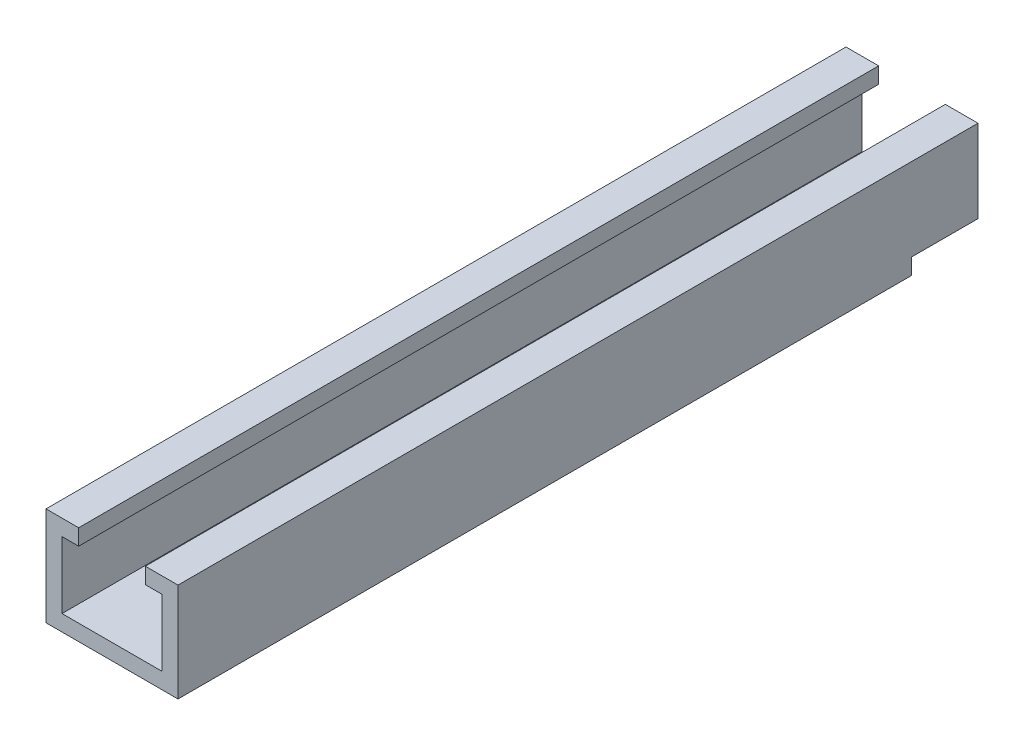
ISO-10303-21;
HEADER;
FILE_DESCRIPTION(('STEP AP214'),'2;1');
FILE_NAME('part.step','',(''),(''),'','','');
FILE_SCHEMA(('AUTOMOTIVE_DESIGN { 1 0 10303 214 1 1 1 1 }'));
ENDSEC;
DATA;
#1=APPLICATION_CONTEXT('core data for automotive mechanical design processes');
#2=APPLICATION_PROTOCOL_DEFINITION('international standard','automotive_design',2000,#1);
#3=PRODUCT_CONTEXT('',#1,'mechanical');
#4=PRODUCT('Part','Part','',(#3));
#5=PRODUCT_RELATED_PRODUCT_CATEGORY('part','',(#4));
#6=PRODUCT_DEFINITION_FORMATION('','',#4);
#7=PRODUCT_DEFINITION_CONTEXT('part definition',#1,'design');
#8=PRODUCT_DEFINITION('design','',#6,#7);
#9=PRODUCT_DEFINITION_SHAPE('','',#8);
#10=(LENGTH_UNIT() NAMED_UNIT(*) SI_UNIT(.MILLI.,.METRE.));
#11=(NAMED_UNIT(*) PLANE_ANGLE_UNIT() SI_UNIT($,.RADIAN.));
#12=(NAMED_UNIT(*) SI_UNIT($,.STERADIAN.) SOLID_ANGLE_UNIT());
#13=UNCERTAINTY_MEASURE_WITH_UNIT(LENGTH_MEASURE(1.E-05),#10,'distance_accuracy_value','');
#14=(GEOMETRIC_REPRESENTATION_CONTEXT(3) GLOBAL_UNCERTAINTY_ASSIGNED_CONTEXT((#13)) GLOBAL_UNIT_ASSIGNED_CONTEXT((#10,
#11,#12)) REPRESENTATION_CONTEXT('',''));
#15=CARTESIAN_POINT('',(0.,0.,0.));
#16=DIRECTION('',(0.,0.,1.));
#17=DIRECTION('',(1.,0.,0.));
#18=AXIS2_PLACEMENT_3D('',#15,#16,#17);
#19=CARTESIAN_POINT('',(0.,0.,0.));
#20=DIRECTION('',(0.,0.,-1.));
#21=DIRECTION('',(-1.,0.,0.));
#22=AXIS2_PLACEMENT_3D('',#19,#20,#21);
#23=PLANE('',#22);
#24=DIRECTION('',(1.,0.,0.));
#25=VECTOR('',#24,1.);
#26=CARTESIAN_POINT('',(0.,12.,0.));
#27=LINE('',#26,#25);
#28=CARTESIAN_POINT('',(0.,12.,0.));
#29=VERTEX_POINT('',#28);
#30=CARTESIAN_POINT('',(12.,12.,0.));
#31=VERTEX_POINT('',#30);
#32=EDGE_CURVE('E191',#29,#31,#27,.T.);
#33=ORIENTED_EDGE('',*,*,#32,.F.);
#34=DIRECTION('',(0.,-1.,0.));
#35=VECTOR('',#34,1.);
#36=CARTESIAN_POINT('',(0.,0.,0.));
#37=LINE('',#36,#35);
#38=CARTESIAN_POINT('',(0.,74.,0.));
#39=VERTEX_POINT('',#38);
#40=EDGE_CURVE('E277',#39,#29,#37,.T.);
#41=ORIENTED_EDGE('',*,*,#40,.F.);
#42=DIRECTION('',(-1.,0.,0.));
#43=VECTOR('',#42,1.);
#44=CARTESIAN_POINT('',(0.,74.,0.));
#45=LINE('',#44,#43);
#46=CARTESIAN_POINT('',(24.5,74.,0.));
#47=VERTEX_POINT('',#46);
#48=EDGE_CURVE('E251',#47,#39,#45,.T.);
#49=ORIENTED_EDGE('',*,*,#48,.F.);
#50=DIRECTION('',(0.,-1.,0.));
#51=VECTOR('',#50,1.);
#52=CARTESIAN_POINT('',(24.5,74.,0.));
#53=LINE('',#52,#51);
#54=CARTESIAN_POINT('',(24.5,62.,0.));
#55=VERTEX_POINT('',#54);
#56=EDGE_CURVE('E254',#47,#55,#53,.T.);
#57=ORIENTED_EDGE('',*,*,#56,.T.);
#58=DIRECTION('',(-1.,0.,0.));
#59=VECTOR('',#58,1.);
#60=CARTESIAN_POINT('',(0.,62.,0.));
#61=LINE('',#60,#59);
#62=CARTESIAN_POINT('',(12.,62.,0.));
#63=VERTEX_POINT('',#62);
#64=EDGE_CURVE('E247',#55,#63,#61,.T.);
#65=ORIENTED_EDGE('',*,*,#64,.T.);
#66=DIRECTION('',(0.,-1.,0.));
#67=VECTOR('',#66,1.);
#68=CARTESIAN_POINT('',(12.,62.,0.));
#69=LINE('',#68,#67);
#70=EDGE_CURVE('E269',#63,#31,#69,.T.);
#71=ORIENTED_EDGE('',*,*,#70,.T.);
#72=EDGE_LOOP('',(#33,#41,#49,#57,#65,#71));
#73=FACE_BOUND('',#72,.T.);
#74=ADVANCED_FACE('F36',(#73),#23,.T.);
#75=CARTESIAN_POINT('',(0.,12.,600.));
#76=DIRECTION('',(0.,-1.,0.));
#77=DIRECTION('',(0.,0.,-1.));
#78=AXIS2_PLACEMENT_3D('',#75,#76,#77);
#79=PLANE('',#78);
#80=DIRECTION('',(0.,0.,-1.));
#81=VECTOR('',#80,1.);
#82=CARTESIAN_POINT('',(87.,12.,0.));
#83=LINE('',#82,#81);
#84=CARTESIAN_POINT('',(86.9999999999999,12.,600.));
#85=VERTEX_POINT('',#84);
#86=CARTESIAN_POINT('',(87.,12.,50.));
#87=VERTEX_POINT('',#86);
#88=EDGE_CURVE('E236',#85,#87,#83,.T.);
#89=ORIENTED_EDGE('',*,*,#88,.T.);
#90=DIRECTION('',(-1.,0.,0.));
#91=VECTOR('',#90,1.);
#92=CARTESIAN_POINT('',(0.,12.,50.));
#93=LINE('',#92,#91);
#94=CARTESIAN_POINT('',(12.,12.,50.));
#95=VERTEX_POINT('',#94);
#96=EDGE_CURVE('E198',#87,#95,#93,.T.);
#97=ORIENTED_EDGE('',*,*,#96,.T.);
#98=DIRECTION('',(0.,0.,-1.));
#99=VECTOR('',#98,1.);
#100=CARTESIAN_POINT('',(12.,12.,0.));
#101=LINE('',#100,#99);
#102=CARTESIAN_POINT('',(12.,12.,600.));
#103=VERTEX_POINT('',#102);
#104=EDGE_CURVE('E265',#103,#95,#101,.T.);
#105=ORIENTED_EDGE('',*,*,#104,.F.);
#106=DIRECTION('',(-1.,0.,0.));
#107=VECTOR('',#106,1.);
#108=CARTESIAN_POINT('',(0.,12.,600.));
#109=LINE('',#108,#107);
#110=EDGE_CURVE('E59',#85,#103,#109,.T.);
#111=ORIENTED_EDGE('',*,*,#110,.F.);
#112=EDGE_LOOP('',(#89,#97,#105,#111));
#113=FACE_BOUND('',#112,.T.);
#114=ADVANCED_FACE('F351',(#113),#79,.F.);
#115=CARTESIAN_POINT('',(0.,0.,600.));
#116=DIRECTION('',(1.,0.,0.));
#117=DIRECTION('',(0.,0.,-1.));
#118=AXIS2_PLACEMENT_3D('',#115,#116,#117);
#119=PLANE('',#118);
#120=DIRECTION('',(0.,0.,-1.));
#121=VECTOR('',#120,1.);
#122=CARTESIAN_POINT('',(0.,12.,0.));
#123=LINE('',#122,#121);
#124=CARTESIAN_POINT('',(0.,12.,50.));
#125=VERTEX_POINT('',#124);
#126=EDGE_CURVE('E188',#125,#29,#123,.T.);
#127=ORIENTED_EDGE('',*,*,#126,.F.);
#128=DIRECTION('',(0.,-1.,0.));
#129=VECTOR('',#128,1.);
#130=CARTESIAN_POINT('',(0.,12.,50.));
#131=LINE('',#130,#129);
#132=CARTESIAN_POINT('',(0.,0.,50.));
#133=VERTEX_POINT('',#132);
#134=EDGE_CURVE('E200',#125,#133,#131,.T.);
#135=ORIENTED_EDGE('',*,*,#134,.T.);
#136=DIRECTION('',(0.,0.,-1.));
#137=VECTOR('',#136,1.);
#138=CARTESIAN_POINT('',(0.,0.,600.));
#139=LINE('',#138,#137);
#140=CARTESIAN_POINT('',(0.,0.,600.));
#141=VERTEX_POINT('',#140);
#142=EDGE_CURVE('E11',#141,#133,#139,.T.);
#143=ORIENTED_EDGE('',*,*,#142,.F.);
#144=DIRECTION('',(0.,-1.,0.));
#145=VECTOR('',#144,1.);
#146=CARTESIAN_POINT('',(0.,0.,600.));
#147=LINE('',#146,#145);
#148=CARTESIAN_POINT('',(0.,74.,600.));
#149=VERTEX_POINT('',#148);
#150=EDGE_CURVE('E278',#149,#141,#147,.T.);
#151=ORIENTED_EDGE('',*,*,#150,.F.);
#152=DIRECTION('',(0.,0.,1.));
#153=VECTOR('',#152,1.);
#154=CARTESIAN_POINT('',(0.,74.,0.));
#155=LINE('',#154,#153);
#156=EDGE_CURVE('E243',#39,#149,#155,.T.);
#157=ORIENTED_EDGE('',*,*,#156,.F.);
#158=ORIENTED_EDGE('',*,*,#40,.T.);
#159=EDGE_LOOP('',(#127,#135,#143,#151,#157,#158));
#160=FACE_BOUND('',#159,.T.);
#161=ADVANCED_FACE('F38',(#160),#119,.F.);
#162=CARTESIAN_POINT('',(0.,0.,600.));
#163=DIRECTION('',(0.,1.,0.));
#164=DIRECTION('',(0.,0.,1.));
#165=AXIS2_PLACEMENT_3D('',#162,#163,#164);
#166=PLANE('',#165);
#167=ORIENTED_EDGE('',*,*,#142,.T.);
#168=DIRECTION('',(-1.,0.,0.));
#169=VECTOR('',#168,1.);
#170=CARTESIAN_POINT('',(0.,0.,50.));
#171=LINE('',#170,#169);
#172=CARTESIAN_POINT('',(99.,0.,50.));
#173=VERTEX_POINT('',#172);
#174=EDGE_CURVE('E187',#173,#133,#171,.T.);
#175=ORIENTED_EDGE('',*,*,#174,.F.);
#176=DIRECTION('',(0.,0.,-1.));
#177=VECTOR('',#176,1.);
#178=CARTESIAN_POINT('',(99.,0.,600.));
#179=LINE('',#178,#177);
#180=CARTESIAN_POINT('',(99.,0.,600.));
#181=VERTEX_POINT('',#180);
#182=EDGE_CURVE('E44',#181,#173,#179,.T.);
#183=ORIENTED_EDGE('',*,*,#182,.F.);
#184=DIRECTION('',(1.,0.,0.));
#185=VECTOR('',#184,1.);
#186=CARTESIAN_POINT('',(0.,0.,600.));
#187=LINE('',#186,#185);
#188=EDGE_CURVE('E281',#141,#181,#187,.T.);
#189=ORIENTED_EDGE('',*,*,#188,.F.);
#190=EDGE_LOOP('',(#167,#175,#183,#189));
#191=FACE_BOUND('',#190,.T.);
#192=ADVANCED_FACE('F298',(#191),#166,.F.);
#193=CARTESIAN_POINT('',(99.,0.,600.));
#194=DIRECTION('',(-1.,0.,0.));
#195=DIRECTION('',(0.,0.,1.));
#196=AXIS2_PLACEMENT_3D('',#193,#194,#195);
#197=PLANE('',#196);
#198=ORIENTED_EDGE('',*,*,#182,.T.);
#199=DIRECTION('',(0.,-1.,0.));
#200=VECTOR('',#199,1.);
#201=CARTESIAN_POINT('',(99.,12.,50.));
#202=LINE('',#201,#200);
#203=CARTESIAN_POINT('',(99.,12.,50.));
#204=VERTEX_POINT('',#203);
#205=EDGE_CURVE('E197',#204,#173,#202,.T.);
#206=ORIENTED_EDGE('',*,*,#205,.F.);
#207=DIRECTION('',(0.,0.,1.));
#208=VECTOR('',#207,1.);
#209=CARTESIAN_POINT('',(99.,12.,0.));
#210=LINE('',#209,#208);
#211=CARTESIAN_POINT('',(99.,12.,0.));
#212=VERTEX_POINT('',#211);
#213=EDGE_CURVE('E193',#212,#204,#210,.T.);
#214=ORIENTED_EDGE('',*,*,#213,.F.);
#215=DIRECTION('',(0.,1.,0.));
#216=VECTOR('',#215,1.);
#217=CARTESIAN_POINT('',(99.,0.,0.));
#218=LINE('',#217,#216);
#219=CARTESIAN_POINT('',(99.,74.,0.));
#220=VERTEX_POINT('',#219);
#221=EDGE_CURVE('E282',#212,#220,#218,.T.);
#222=ORIENTED_EDGE('',*,*,#221,.T.);
#223=DIRECTION('',(0.,0.,1.));
#224=VECTOR('',#223,1.);
#225=CARTESIAN_POINT('',(99.,74.,0.));
#226=LINE('',#225,#224);
#227=CARTESIAN_POINT('',(98.9999999999999,74.,600.));
#228=VERTEX_POINT('',#227);
#229=EDGE_CURVE('E208',#220,#228,#226,.T.);
#230=ORIENTED_EDGE('',*,*,#229,.T.);
#231=DIRECTION('',(0.,1.,0.));
#232=VECTOR('',#231,1.);
#233=CARTESIAN_POINT('',(99.,0.,600.));
#234=LINE('',#233,#232);
#235=EDGE_CURVE('E284',#181,#228,#234,.T.);
#236=ORIENTED_EDGE('',*,*,#235,.F.);
#237=EDGE_LOOP('',(#198,#206,#214,#222,#230,#236));
#238=FACE_BOUND('',#237,.T.);
#239=ADVANCED_FACE('F294',(#238),#197,.F.);
#240=CARTESIAN_POINT('',(0.,0.,600.));
#241=DIRECTION('',(0.,0.,-1.));
#242=DIRECTION('',(-1.,0.,0.));
#243=AXIS2_PLACEMENT_3D('',#240,#241,#242);
#244=PLANE('',#243);
#245=ORIENTED_EDGE('',*,*,#150,.T.);
#246=ORIENTED_EDGE('',*,*,#188,.T.);
#247=ORIENTED_EDGE('',*,*,#235,.T.);
#248=DIRECTION('',(-1.,0.,0.));
#249=VECTOR('',#248,1.);
#250=CARTESIAN_POINT('',(98.9999999999999,74.,600.));
#251=LINE('',#250,#249);
#252=CARTESIAN_POINT('',(74.4999999999999,74.,600.));
#253=VERTEX_POINT('',#252);
#254=EDGE_CURVE('E218',#228,#253,#251,.T.);
#255=ORIENTED_EDGE('',*,*,#254,.T.);
#256=DIRECTION('',(0.,-1.,0.));
#257=VECTOR('',#256,1.);
#258=CARTESIAN_POINT('',(74.4999999999999,74.,600.));
#259=LINE('',#258,#257);
#260=CARTESIAN_POINT('',(74.4999999999999,62.,600.));
#261=VERTEX_POINT('',#260);
#262=EDGE_CURVE('E221',#253,#261,#259,.T.);
#263=ORIENTED_EDGE('',*,*,#262,.T.);
#264=DIRECTION('',(-1.,0.,0.));
#265=VECTOR('',#264,1.);
#266=CARTESIAN_POINT('',(98.9999999999999,62.,600.));
#267=LINE('',#266,#265);
#268=CARTESIAN_POINT('',(86.9999999999999,62.,600.));
#269=VERTEX_POINT('',#268);
#270=EDGE_CURVE('E212',#269,#261,#267,.T.);
#271=ORIENTED_EDGE('',*,*,#270,.F.);
#272=DIRECTION('',(0.,-1.,0.));
#273=VECTOR('',#272,1.);
#274=CARTESIAN_POINT('',(86.9999999999999,62.,600.));
#275=LINE('',#274,#273);
#276=EDGE_CURVE('E235',#269,#85,#275,.T.);
#277=ORIENTED_EDGE('',*,*,#276,.T.);
#278=ORIENTED_EDGE('',*,*,#110,.T.);
#279=DIRECTION('',(0.,-1.,0.));
#280=VECTOR('',#279,1.);
#281=CARTESIAN_POINT('',(12.0000000000001,62.,600.));
#282=LINE('',#281,#280);
#283=CARTESIAN_POINT('',(12.0000000000001,62.,600.));
#284=VERTEX_POINT('',#283);
#285=EDGE_CURVE('E274',#284,#103,#282,.T.);
#286=ORIENTED_EDGE('',*,*,#285,.F.);
#287=DIRECTION('',(1.,0.,0.));
#288=VECTOR('',#287,1.);
#289=CARTESIAN_POINT('',(0.,62.,600.));
#290=LINE('',#289,#288);
#291=CARTESIAN_POINT('',(24.5000000000001,62.,600.));
#292=VERTEX_POINT('',#291);
#293=EDGE_CURVE('E242',#284,#292,#290,.T.);
#294=ORIENTED_EDGE('',*,*,#293,.T.);
#295=DIRECTION('',(0.,-1.,0.));
#296=VECTOR('',#295,1.);
#297=CARTESIAN_POINT('',(24.5000000000001,74.,600.));
#298=LINE('',#297,#296);
#299=CARTESIAN_POINT('',(24.5000000000001,74.,600.));
#300=VERTEX_POINT('',#299);
#301=EDGE_CURVE('E262',#300,#292,#298,.T.);
#302=ORIENTED_EDGE('',*,*,#301,.F.);
#303=DIRECTION('',(1.,0.,0.));
#304=VECTOR('',#303,1.);
#305=CARTESIAN_POINT('',(0.,74.,600.));
#306=LINE('',#305,#304);
#307=EDGE_CURVE('E246',#149,#300,#306,.T.);
#308=ORIENTED_EDGE('',*,*,#307,.F.);
#309=EDGE_LOOP('',(#245,#246,#247,#255,#263,#271,#277,#278,#286,#294,#302,#308));
#310=FACE_BOUND('',#309,.T.);
#311=ADVANCED_FACE('F322',(#310),#244,.F.);
#312=CARTESIAN_POINT('',(87.,12.,0.));
#313=VERTEX_POINT('',#312);
#314=EDGE_CURVE('E190',#313,#212,#27,.T.);
#315=ORIENTED_EDGE('',*,*,#314,.F.);
#316=DIRECTION('',(0.,-1.,0.));
#317=VECTOR('',#316,1.);
#318=CARTESIAN_POINT('',(87.,62.,0.));
#319=LINE('',#318,#317);
#320=CARTESIAN_POINT('',(86.9999999999999,62.,0.));
#321=VERTEX_POINT('',#320);
#322=EDGE_CURVE('E239',#321,#313,#319,.T.);
#323=ORIENTED_EDGE('',*,*,#322,.F.);
#324=DIRECTION('',(1.,0.,0.));
#325=VECTOR('',#324,1.);
#326=CARTESIAN_POINT('',(99.,62.,0.));
#327=LINE('',#326,#325);
#328=CARTESIAN_POINT('',(74.5,62.,0.));
#329=VERTEX_POINT('',#328);
#330=EDGE_CURVE('E207',#329,#321,#327,.T.);
#331=ORIENTED_EDGE('',*,*,#330,.F.);
#332=DIRECTION('',(0.,-1.,0.));
#333=VECTOR('',#332,1.);
#334=CARTESIAN_POINT('',(74.5,74.,0.));
#335=LINE('',#334,#333);
#336=CARTESIAN_POINT('',(74.5,74.,0.));
#337=VERTEX_POINT('',#336);
#338=EDGE_CURVE('E229',#337,#329,#335,.T.);
#339=ORIENTED_EDGE('',*,*,#338,.F.);
#340=DIRECTION('',(1.,0.,0.));
#341=VECTOR('',#340,1.);
#342=CARTESIAN_POINT('',(99.,74.,0.));
#343=LINE('',#342,#341);
#344=EDGE_CURVE('E211',#337,#220,#343,.T.);
#345=ORIENTED_EDGE('',*,*,#344,.T.);
#346=ORIENTED_EDGE('',*,*,#221,.F.);
#347=EDGE_LOOP('',(#315,#323,#331,#339,#345,#346));
#348=FACE_BOUND('',#347,.T.);
#349=ADVANCED_FACE('F359',(#348),#23,.T.);
#350=CARTESIAN_POINT('',(12.,62.,0.));
#351=DIRECTION('',(-1.,0.,0.));
#352=DIRECTION('',(0.,-1.,0.));
#353=AXIS2_PLACEMENT_3D('',#350,#351,#352);
#354=PLANE('',#353);
#355=ORIENTED_EDGE('',*,*,#104,.T.);
#356=DIRECTION('',(0.,0.,-1.));
#357=VECTOR('',#356,1.);
#358=CARTESIAN_POINT('',(12.,12.,0.));
#359=LINE('',#358,#357);
#360=EDGE_CURVE('E203',#95,#31,#359,.T.);
#361=ORIENTED_EDGE('',*,*,#360,.T.);
#362=ORIENTED_EDGE('',*,*,#70,.F.);
#363=DIRECTION('',(0.,0.,-1.));
#364=VECTOR('',#363,1.);
#365=CARTESIAN_POINT('',(12.,62.,0.));
#366=LINE('',#365,#364);
#367=EDGE_CURVE('E266',#284,#63,#366,.T.);
#368=ORIENTED_EDGE('',*,*,#367,.F.);
#369=ORIENTED_EDGE('',*,*,#285,.T.);
#370=EDGE_LOOP('',(#355,#361,#362,#368,#369));
#371=FACE_BOUND('',#370,.T.);
#372=ADVANCED_FACE('F315',(#371),#354,.F.);
#373=CARTESIAN_POINT('',(0.,62.,0.));
#374=DIRECTION('',(0.,1.,0.));
#375=DIRECTION('',(0.,0.,1.));
#376=AXIS2_PLACEMENT_3D('',#373,#374,#375);
#377=PLANE('',#376);
#378=ORIENTED_EDGE('',*,*,#293,.F.);
#379=ORIENTED_EDGE('',*,*,#367,.T.);
#380=ORIENTED_EDGE('',*,*,#64,.F.);
#381=DIRECTION('',(0.,0.,-1.));
#382=VECTOR('',#381,1.);
#383=CARTESIAN_POINT('',(24.5,62.,0.));
#384=LINE('',#383,#382);
#385=EDGE_CURVE('E256',#292,#55,#384,.T.);
#386=ORIENTED_EDGE('',*,*,#385,.F.);
#387=EDGE_LOOP('',(#378,#379,#380,#386));
#388=FACE_BOUND('',#387,.T.);
#389=ADVANCED_FACE('F318',(#388),#377,.F.);
#390=CARTESIAN_POINT('',(24.5,74.,0.));
#391=DIRECTION('',(-1.,0.,0.));
#392=DIRECTION('',(0.,-1.,0.));
#393=AXIS2_PLACEMENT_3D('',#390,#391,#392);
#394=PLANE('',#393);
#395=ORIENTED_EDGE('',*,*,#385,.T.);
#396=ORIENTED_EDGE('',*,*,#56,.F.);
#397=DIRECTION('',(0.,0.,-1.));
#398=VECTOR('',#397,1.);
#399=CARTESIAN_POINT('',(24.5,74.,0.));
#400=LINE('',#399,#398);
#401=EDGE_CURVE('E249',#300,#47,#400,.T.);
#402=ORIENTED_EDGE('',*,*,#401,.F.);
#403=ORIENTED_EDGE('',*,*,#301,.T.);
#404=EDGE_LOOP('',(#395,#396,#402,#403));
#405=FACE_BOUND('',#404,.T.);
#406=ADVANCED_FACE('F326',(#405),#394,.F.);
#407=CARTESIAN_POINT('',(0.,74.,0.));
#408=DIRECTION('',(0.,1.,0.));
#409=DIRECTION('',(0.,0.,1.));
#410=AXIS2_PLACEMENT_3D('',#407,#408,#409);
#411=PLANE('',#410);
#412=ORIENTED_EDGE('',*,*,#156,.T.);
#413=ORIENTED_EDGE('',*,*,#307,.T.);
#414=ORIENTED_EDGE('',*,*,#401,.T.);
#415=ORIENTED_EDGE('',*,*,#48,.T.);
#416=EDGE_LOOP('',(#412,#413,#414,#415));
#417=FACE_BOUND('',#416,.T.);
#418=ADVANCED_FACE('F329',(#417),#411,.T.);
#419=CARTESIAN_POINT('',(87.,62.,0.));
#420=DIRECTION('',(-1.,0.,0.));
#421=DIRECTION('',(0.,-1.,0.));
#422=AXIS2_PLACEMENT_3D('',#419,#420,#421);
#423=PLANE('',#422);
#424=ORIENTED_EDGE('',*,*,#88,.F.);
#425=ORIENTED_EDGE('',*,*,#276,.F.);
#426=DIRECTION('',(0.,0.,-1.));
#427=VECTOR('',#426,1.);
#428=CARTESIAN_POINT('',(87.,62.,0.));
#429=LINE('',#428,#427);
#430=EDGE_CURVE('E232',#269,#321,#429,.T.);
#431=ORIENTED_EDGE('',*,*,#430,.T.);
#432=ORIENTED_EDGE('',*,*,#322,.T.);
#433=EDGE_CURVE('E231',#87,#313,#83,.T.);
#434=ORIENTED_EDGE('',*,*,#433,.F.);
#435=EDGE_LOOP('',(#424,#425,#431,#432,#434));
#436=FACE_BOUND('',#435,.T.);
#437=ADVANCED_FACE('F348',(#436),#423,.T.);
#438=CARTESIAN_POINT('',(74.5,74.,0.));
#439=DIRECTION('',(-1.,0.,0.));
#440=DIRECTION('',(0.,-1.,0.));
#441=AXIS2_PLACEMENT_3D('',#438,#439,#440);
#442=PLANE('',#441);
#443=DIRECTION('',(0.,0.,-1.));
#444=VECTOR('',#443,1.);
#445=CARTESIAN_POINT('',(74.5,62.,0.));
#446=LINE('',#445,#444);
#447=EDGE_CURVE('E223',#261,#329,#446,.T.);
#448=ORIENTED_EDGE('',*,*,#447,.F.);
#449=ORIENTED_EDGE('',*,*,#262,.F.);
#450=DIRECTION('',(0.,0.,-1.));
#451=VECTOR('',#450,1.);
#452=CARTESIAN_POINT('',(74.5,74.,0.));
#453=LINE('',#452,#451);
#454=EDGE_CURVE('E215',#253,#337,#453,.T.);
#455=ORIENTED_EDGE('',*,*,#454,.T.);
#456=ORIENTED_EDGE('',*,*,#338,.T.);
#457=EDGE_LOOP('',(#448,#449,#455,#456));
#458=FACE_BOUND('',#457,.T.);
#459=ADVANCED_FACE('F339',(#458),#442,.T.);
#460=CARTESIAN_POINT('',(99.,74.,0.));
#461=DIRECTION('',(0.,1.,0.));
#462=DIRECTION('',(0.,0.,1.));
#463=AXIS2_PLACEMENT_3D('',#460,#461,#462);
#464=PLANE('',#463);
#465=ORIENTED_EDGE('',*,*,#229,.F.);
#466=ORIENTED_EDGE('',*,*,#344,.F.);
#467=ORIENTED_EDGE('',*,*,#454,.F.);
#468=ORIENTED_EDGE('',*,*,#254,.F.);
#469=EDGE_LOOP('',(#465,#466,#467,#468));
#470=FACE_BOUND('',#469,.T.);
#471=ADVANCED_FACE('F336',(#470),#464,.T.);
#472=CARTESIAN_POINT('',(99.,62.,0.));
#473=DIRECTION('',(0.,1.,0.));
#474=DIRECTION('',(0.,0.,1.));
#475=AXIS2_PLACEMENT_3D('',#472,#473,#474);
#476=PLANE('',#475);
#477=ORIENTED_EDGE('',*,*,#430,.F.);
#478=ORIENTED_EDGE('',*,*,#270,.T.);
#479=ORIENTED_EDGE('',*,*,#447,.T.);
#480=ORIENTED_EDGE('',*,*,#330,.T.);
#481=EDGE_LOOP('',(#477,#478,#479,#480));
#482=FACE_BOUND('',#481,.T.);
#483=ADVANCED_FACE('F345',(#482),#476,.F.);
#484=CARTESIAN_POINT('',(0.,12.,0.));
#485=DIRECTION('',(0.,1.,0.));
#486=DIRECTION('',(0.,0.,1.));
#487=AXIS2_PLACEMENT_3D('',#484,#485,#486);
#488=PLANE('',#487);
#489=CARTESIAN_POINT('',(6.,12.,40.));
#490=DIRECTION('',(0.,-1.,0.));
#491=DIRECTION('',(0.,0.,-1.));
#492=AXIS2_PLACEMENT_3D('',#489,#490,#491);
#493=CIRCLE('',#492,2.1);
#494=CARTESIAN_POINT('',(6.,12.,37.9));
#495=VERTEX_POINT('',#494);
#496=EDGE_CURVE('E164',#495,#495,#493,.T.);
#497=ORIENTED_EDGE('',*,*,#496,.F.);
#498=EDGE_LOOP('',(#497));
#499=FACE_BOUND('',#498,.T.);
#500=CARTESIAN_POINT('',(6.,12.,10.));
#501=DIRECTION('',(0.,-1.,0.));
#502=DIRECTION('',(0.,0.,-1.));
#503=AXIS2_PLACEMENT_3D('',#500,#501,#502);
#504=CIRCLE('',#503,2.1);
#505=CARTESIAN_POINT('',(6.,12.,7.9));
#506=VERTEX_POINT('',#505);
#507=EDGE_CURVE('E181',#506,#506,#504,.T.);
#508=ORIENTED_EDGE('',*,*,#507,.F.);
#509=EDGE_LOOP('',(#508));
#510=FACE_BOUND('',#509,.T.);
#511=EDGE_CURVE('E195',#95,#125,#93,.T.);
#512=ORIENTED_EDGE('',*,*,#511,.T.);
#513=ORIENTED_EDGE('',*,*,#126,.T.);
#514=ORIENTED_EDGE('',*,*,#32,.T.);
#515=ORIENTED_EDGE('',*,*,#360,.F.);
#516=EDGE_LOOP('',(#512,#513,#514,#515));
#517=FACE_BOUND('',#516,.T.);
#518=ADVANCED_FACE('F309',(#499,#510,#517),#488,.F.);
#519=CARTESIAN_POINT('',(0.,12.,50.));
#520=DIRECTION('',(0.,0.,1.));
#521=DIRECTION('',(1.,0.,0.));
#522=AXIS2_PLACEMENT_3D('',#519,#520,#521);
#523=PLANE('',#522);
#524=ORIENTED_EDGE('',*,*,#174,.T.);
#525=ORIENTED_EDGE('',*,*,#134,.F.);
#526=ORIENTED_EDGE('',*,*,#511,.F.);
#527=ORIENTED_EDGE('',*,*,#96,.F.);
#528=EDGE_CURVE('E51',#204,#87,#93,.T.);
#529=ORIENTED_EDGE('',*,*,#528,.F.);
#530=ORIENTED_EDGE('',*,*,#205,.T.);
#531=EDGE_LOOP('',(#524,#525,#526,#527,#529,#530));
#532=FACE_BOUND('',#531,.T.);
#533=ADVANCED_FACE('F302',(#532),#523,.F.);
#534=CARTESIAN_POINT('',(93.,12.,10.));
#535=DIRECTION('',(0.,-1.,0.));
#536=DIRECTION('',(0.,0.,-1.));
#537=AXIS2_PLACEMENT_3D('',#534,#535,#536);
#538=CIRCLE('',#537,2.1);
#539=CARTESIAN_POINT('',(93.,12.,7.9));
#540=VERTEX_POINT('',#539);
#541=EDGE_CURVE('E165',#540,#540,#538,.T.);
#542=ORIENTED_EDGE('',*,*,#541,.F.);
#543=EDGE_LOOP('',(#542));
#544=FACE_BOUND('',#543,.T.);
#545=CARTESIAN_POINT('',(93.,12.,40.));
#546=DIRECTION('',(0.,-1.,0.));
#547=DIRECTION('',(0.,0.,-1.));
#548=AXIS2_PLACEMENT_3D('',#545,#546,#547);
#549=CIRCLE('',#548,2.1);
#550=CARTESIAN_POINT('',(93.,12.,37.9));
#551=VERTEX_POINT('',#550);
#552=EDGE_CURVE('E175',#551,#551,#549,.T.);
#553=ORIENTED_EDGE('',*,*,#552,.F.);
#554=EDGE_LOOP('',(#553));
#555=FACE_BOUND('',#554,.T.);
#556=ORIENTED_EDGE('',*,*,#433,.T.);
#557=ORIENTED_EDGE('',*,*,#314,.T.);
#558=ORIENTED_EDGE('',*,*,#213,.T.);
#559=ORIENTED_EDGE('',*,*,#528,.T.);
#560=EDGE_LOOP('',(#556,#557,#558,#559));
#561=FACE_BOUND('',#560,.T.);
#562=ADVANCED_FACE('F441',(#544,#555,#561),#488,.F.);
#563=CARTESIAN_POINT('',(6.,26.,10.));
#564=DIRECTION('',(0.,-1.,0.));
#565=DIRECTION('',(0.,0.,-1.));
#566=AXIS2_PLACEMENT_3D('',#563,#564,#565);
#567=CONICAL_SURFACE('',#566,2.1,1.02974425867665);
#568=CARTESIAN_POINT('',(5.99999999999999,27.2618072999579,10.));
#569=VERTEX_POINT('',#568);
#570=VERTEX_LOOP('',#569);
#571=FACE_BOUND('',#570,.T.);
#572=CARTESIAN_POINT('',(6.,26.,10.));
#573=DIRECTION('',(0.,-1.,0.));
#574=DIRECTION('',(0.,0.,-1.));
#575=AXIS2_PLACEMENT_3D('',#572,#573,#574);
#576=CIRCLE('',#575,2.1);
#577=CARTESIAN_POINT('',(6.,26.,7.9));
#578=VERTEX_POINT('',#577);
#579=EDGE_CURVE('E184',#578,#578,#576,.T.);
#580=ORIENTED_EDGE('',*,*,#579,.T.);
#581=EDGE_LOOP('',(#580));
#582=FACE_BOUND('',#581,.T.);
#583=ADVANCED_FACE('F452',(#571,#582),#567,.F.);
#584=CARTESIAN_POINT('',(6.,12.,10.));
#585=DIRECTION('',(0.,-1.,0.));
#586=DIRECTION('',(0.,0.,-1.));
#587=AXIS2_PLACEMENT_3D('',#584,#585,#586);
#588=CYLINDRICAL_SURFACE('',#587,2.1);
#589=ORIENTED_EDGE('',*,*,#579,.F.);
#590=EDGE_LOOP('',(#589));
#591=FACE_BOUND('',#590,.T.);
#592=ORIENTED_EDGE('',*,*,#507,.T.);
#593=EDGE_LOOP('',(#592));
#594=FACE_BOUND('',#593,.T.);
#595=ADVANCED_FACE('F459',(#591,#594),#588,.F.);
#596=CARTESIAN_POINT('',(93.,26.,40.));
#597=DIRECTION('',(0.,-1.,0.));
#598=DIRECTION('',(0.,0.,-1.));
#599=AXIS2_PLACEMENT_3D('',#596,#597,#598);
#600=CONICAL_SURFACE('',#599,2.1,1.02974425867666);
#601=CARTESIAN_POINT('',(93.,27.2618072999579,40.));
#602=VERTEX_POINT('',#601);
#603=VERTEX_LOOP('',#602);
#604=FACE_BOUND('',#603,.T.);
#605=CARTESIAN_POINT('',(93.,26.,40.));
#606=DIRECTION('',(0.,-1.,0.));
#607=DIRECTION('',(0.,0.,-1.));
#608=AXIS2_PLACEMENT_3D('',#605,#606,#607);
#609=CIRCLE('',#608,2.1);
#610=CARTESIAN_POINT('',(93.,26.,37.9));
#611=VERTEX_POINT('',#610);
#612=EDGE_CURVE('E178',#611,#611,#609,.T.);
#613=ORIENTED_EDGE('',*,*,#612,.T.);
#614=EDGE_LOOP('',(#613));
#615=FACE_BOUND('',#614,.T.);
#616=ADVANCED_FACE('F468',(#604,#615),#600,.F.);
#617=CARTESIAN_POINT('',(93.,12.,40.));
#618=DIRECTION('',(0.,-1.,0.));
#619=DIRECTION('',(0.,0.,-1.));
#620=AXIS2_PLACEMENT_3D('',#617,#618,#619);
#621=CYLINDRICAL_SURFACE('',#620,2.1);
#622=ORIENTED_EDGE('',*,*,#612,.F.);
#623=EDGE_LOOP('',(#622));
#624=FACE_BOUND('',#623,.T.);
#625=ORIENTED_EDGE('',*,*,#552,.T.);
#626=EDGE_LOOP('',(#625));
#627=FACE_BOUND('',#626,.T.);
#628=ADVANCED_FACE('F477',(#624,#627),#621,.F.);
#629=CARTESIAN_POINT('',(6.,26.,40.));
#630=DIRECTION('',(0.,-1.,0.));
#631=DIRECTION('',(0.,0.,-1.));
#632=AXIS2_PLACEMENT_3D('',#629,#630,#631);
#633=CONICAL_SURFACE('',#632,2.1,1.02974425867665);
#634=CARTESIAN_POINT('',(5.99999999999999,27.2618072999579,40.));
#635=VERTEX_POINT('',#634);
#636=VERTEX_LOOP('',#635);
#637=FACE_BOUND('',#636,.T.);
#638=CARTESIAN_POINT('',(6.,26.,40.));
#639=DIRECTION('',(0.,-1.,0.));
#640=DIRECTION('',(0.,0.,-1.));
#641=AXIS2_PLACEMENT_3D('',#638,#639,#640);
#642=CIRCLE('',#641,2.1);
#643=CARTESIAN_POINT('',(6.,26.,37.9));
#644=VERTEX_POINT('',#643);
#645=EDGE_CURVE('E168',#644,#644,#642,.T.);
#646=ORIENTED_EDGE('',*,*,#645,.T.);
#647=EDGE_LOOP('',(#646));
#648=FACE_BOUND('',#647,.T.);
#649=ADVANCED_FACE('F485',(#637,#648),#633,.F.);
#650=CARTESIAN_POINT('',(6.,12.,40.));
#651=DIRECTION('',(0.,-1.,0.));
#652=DIRECTION('',(0.,0.,-1.));
#653=AXIS2_PLACEMENT_3D('',#650,#651,#652);
#654=CYLINDRICAL_SURFACE('',#653,2.1);
#655=ORIENTED_EDGE('',*,*,#645,.F.);
#656=EDGE_LOOP('',(#655));
#657=FACE_BOUND('',#656,.T.);
#658=ORIENTED_EDGE('',*,*,#496,.T.);
#659=EDGE_LOOP('',(#658));
#660=FACE_BOUND('',#659,.T.);
#661=ADVANCED_FACE('F158',(#657,#660),#654,.F.);
#662=CARTESIAN_POINT('',(93.,26.,10.));
#663=DIRECTION('',(0.,-1.,0.));
#664=DIRECTION('',(0.,0.,-1.));
#665=AXIS2_PLACEMENT_3D('',#662,#663,#664);
#666=CONICAL_SURFACE('',#665,2.1,1.02974425867666);
#667=CARTESIAN_POINT('',(93.,27.2618072999579,10.));
#668=VERTEX_POINT('',#667);
#669=VERTEX_LOOP('',#668);
#670=FACE_BOUND('',#669,.T.);
#671=CARTESIAN_POINT('',(93.,26.,10.));
#672=DIRECTION('',(0.,-1.,0.));
#673=DIRECTION('',(0.,0.,-1.));
#674=AXIS2_PLACEMENT_3D('',#671,#672,#673);
#675=CIRCLE('',#674,2.1);
#676=CARTESIAN_POINT('',(93.,26.,7.9));
#677=VERTEX_POINT('',#676);
#678=EDGE_CURVE('E162',#677,#677,#675,.T.);
#679=ORIENTED_EDGE('',*,*,#678,.T.);
#680=EDGE_LOOP('',(#679));
#681=FACE_BOUND('',#680,.T.);
#682=ADVANCED_FACE('F154',(#670,#681),#666,.F.);
#683=CARTESIAN_POINT('',(93.,12.,10.));
#684=DIRECTION('',(0.,-1.,0.));
#685=DIRECTION('',(0.,0.,-1.));
#686=AXIS2_PLACEMENT_3D('',#683,#684,#685);
#687=CYLINDRICAL_SURFACE('',#686,2.1);
#688=ORIENTED_EDGE('',*,*,#678,.F.);
#689=EDGE_LOOP('',(#688));
#690=FACE_BOUND('',#689,.T.);
#691=ORIENTED_EDGE('',*,*,#541,.T.);
#692=EDGE_LOOP('',(#691));
#693=FACE_BOUND('',#692,.T.);
#694=ADVANCED_FACE('F157',(#690,#693),#687,.F.);
#695=CLOSED_SHELL('',(#74,#114,#161,#192,#239,#311,#349,#372,#389,#406,#418,#437,#459,#471,#483,
#518,#533,#562,#583,#595,#616,#628,#649,#661,#682,#694));
#696=MANIFOLD_SOLID_BREP('B2',#695);
#697=ADVANCED_BREP_SHAPE_REPRESENTATION('',(#18,#696),#14);
#698=SHAPE_DEFINITION_REPRESENTATION(#9,#697);
ENDSEC;
END-ISO-10303-21;
